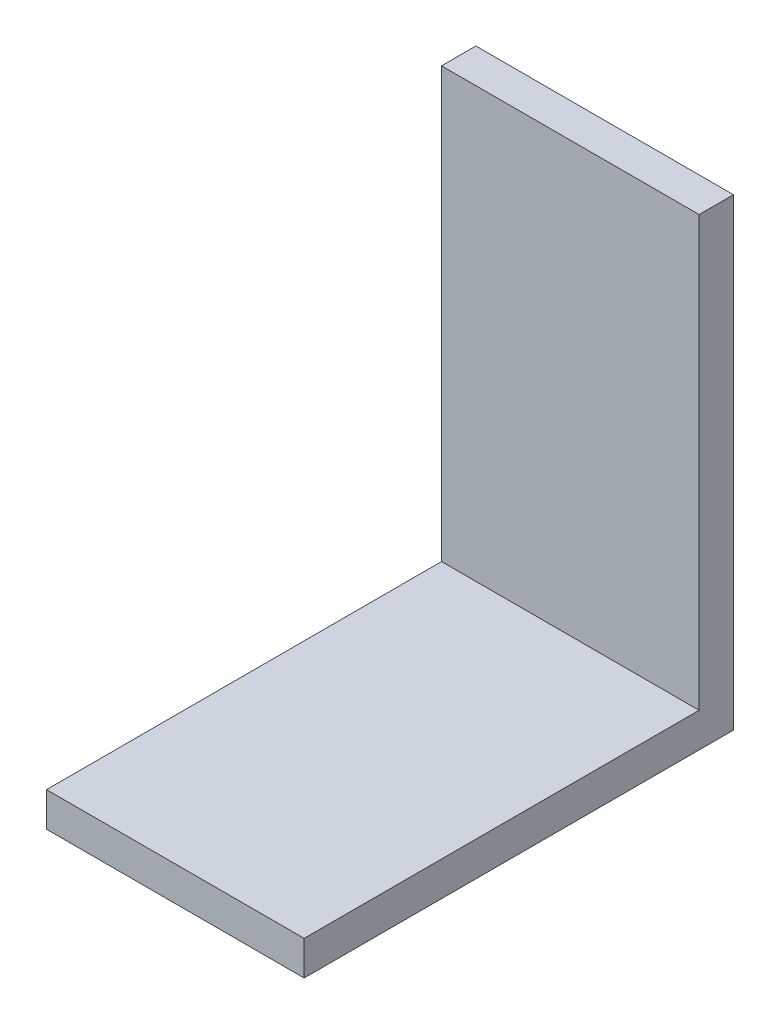
ISO-10303-21;
HEADER;
FILE_DESCRIPTION(('STEP AP214'),'2;1');
FILE_NAME('part.step','',(''),(''),'','','');
FILE_SCHEMA(('AUTOMOTIVE_DESIGN { 1 0 10303 214 1 1 1 1 }'));
ENDSEC;
DATA;
#1=APPLICATION_CONTEXT('core data for automotive mechanical design processes');
#2=APPLICATION_PROTOCOL_DEFINITION('international standard','automotive_design',2000,#1);
#3=PRODUCT_CONTEXT('',#1,'mechanical');
#4=PRODUCT('Part','Part','',(#3));
#5=PRODUCT_RELATED_PRODUCT_CATEGORY('part','',(#4));
#6=PRODUCT_DEFINITION_FORMATION('','',#4);
#7=PRODUCT_DEFINITION_CONTEXT('part definition',#1,'design');
#8=PRODUCT_DEFINITION('design','',#6,#7);
#9=PRODUCT_DEFINITION_SHAPE('','',#8);
#10=(LENGTH_UNIT() NAMED_UNIT(*) SI_UNIT(.MILLI.,.METRE.));
#11=(NAMED_UNIT(*) PLANE_ANGLE_UNIT() SI_UNIT($,.RADIAN.));
#12=(NAMED_UNIT(*) SI_UNIT($,.STERADIAN.) SOLID_ANGLE_UNIT());
#13=UNCERTAINTY_MEASURE_WITH_UNIT(LENGTH_MEASURE(1.E-05),#10,'distance_accuracy_value','');
#14=(GEOMETRIC_REPRESENTATION_CONTEXT(3) GLOBAL_UNCERTAINTY_ASSIGNED_CONTEXT((#13)) GLOBAL_UNIT_ASSIGNED_CONTEXT((#10,
#11,#12)) REPRESENTATION_CONTEXT('',''));
#15=CARTESIAN_POINT('',(0.,0.,0.));
#16=DIRECTION('',(0.,0.,1.));
#17=DIRECTION('',(1.,0.,0.));
#18=AXIS2_PLACEMENT_3D('',#15,#16,#17);
#19=CARTESIAN_POINT('',(0.,2.,0.));
#20=DIRECTION('',(0.,-1.,0.));
#21=DIRECTION('',(0.,0.,-1.));
#22=AXIS2_PLACEMENT_3D('',#19,#20,#21);
#23=PLANE('',#22);
#24=DIRECTION('',(1.,0.,0.));
#25=VECTOR('',#24,1.);
#26=CARTESIAN_POINT('',(-7.5,2.,-10.5));
#27=LINE('',#26,#25);
#28=CARTESIAN_POINT('',(-7.5,2.,-10.5));
#29=VERTEX_POINT('',#28);
#30=CARTESIAN_POINT('',(7.5,2.,-10.5));
#31=VERTEX_POINT('',#30);
#32=EDGE_CURVE('E55',#29,#31,#27,.T.);
#33=ORIENTED_EDGE('',*,*,#32,.F.);
#34=DIRECTION('',(0.,0.,1.));
#35=VECTOR('',#34,1.);
#36=CARTESIAN_POINT('',(-7.5,2.,12.5));
#37=LINE('',#36,#35);
#38=CARTESIAN_POINT('',(-7.5,2.,12.5));
#39=VERTEX_POINT('',#38);
#40=EDGE_CURVE('E157',#29,#39,#37,.T.);
#41=ORIENTED_EDGE('',*,*,#40,.T.);
#42=DIRECTION('',(1.,0.,0.));
#43=VECTOR('',#42,1.);
#44=CARTESIAN_POINT('',(-7.5,2.,12.5));
#45=LINE('',#44,#43);
#46=CARTESIAN_POINT('',(7.5,2.,12.5));
#47=VERTEX_POINT('',#46);
#48=EDGE_CURVE('E61',#39,#47,#45,.T.);
#49=ORIENTED_EDGE('',*,*,#48,.T.);
#50=DIRECTION('',(0.,0.,-1.));
#51=VECTOR('',#50,1.);
#52=CARTESIAN_POINT('',(7.5,2.,12.5));
#53=LINE('',#52,#51);
#54=EDGE_CURVE('E91',#47,#31,#53,.T.);
#55=ORIENTED_EDGE('',*,*,#54,.T.);
#56=EDGE_LOOP('',(#33,#41,#49,#55));
#57=FACE_BOUND('',#56,.T.);
#58=ADVANCED_FACE('F39',(#57),#23,.F.);
#59=CARTESIAN_POINT('',(7.5,2.,12.5));
#60=DIRECTION('',(-1.,0.,0.));
#61=DIRECTION('',(0.,0.,1.));
#62=AXIS2_PLACEMENT_3D('',#59,#60,#61);
#63=PLANE('',#62);
#64=DIRECTION('',(0.,0.,-1.));
#65=VECTOR('',#64,1.);
#66=CARTESIAN_POINT('',(7.5,0.,12.5));
#67=LINE('',#66,#65);
#68=CARTESIAN_POINT('',(7.5,0.,12.5));
#69=VERTEX_POINT('',#68);
#70=CARTESIAN_POINT('',(7.5,0.,-12.5));
#71=VERTEX_POINT('',#70);
#72=EDGE_CURVE('E97',#69,#71,#67,.T.);
#73=ORIENTED_EDGE('',*,*,#72,.T.);
#74=DIRECTION('',(0.,-1.,0.));
#75=VECTOR('',#74,1.);
#76=CARTESIAN_POINT('',(7.5,2.,-12.5));
#77=LINE('',#76,#75);
#78=CARTESIAN_POINT('',(7.5,27.,-12.5));
#79=VERTEX_POINT('',#78);
#80=EDGE_CURVE('E11',#79,#71,#77,.T.);
#81=ORIENTED_EDGE('',*,*,#80,.F.);
#82=DIRECTION('',(0.,0.,-1.));
#83=VECTOR('',#82,1.);
#84=CARTESIAN_POINT('',(7.5,27.,-10.5));
#85=LINE('',#84,#83);
#86=CARTESIAN_POINT('',(7.5,27.,-10.5));
#87=VERTEX_POINT('',#86);
#88=EDGE_CURVE('E141',#87,#79,#85,.T.);
#89=ORIENTED_EDGE('',*,*,#88,.F.);
#90=DIRECTION('',(0.,-1.,0.));
#91=VECTOR('',#90,1.);
#92=CARTESIAN_POINT('',(7.5,27.,-10.5));
#93=LINE('',#92,#91);
#94=EDGE_CURVE('E110',#87,#31,#93,.T.);
#95=ORIENTED_EDGE('',*,*,#94,.T.);
#96=ORIENTED_EDGE('',*,*,#54,.F.);
#97=DIRECTION('',(0.,-1.,0.));
#98=VECTOR('',#97,1.);
#99=CARTESIAN_POINT('',(7.5,2.,12.5));
#100=LINE('',#99,#98);
#101=EDGE_CURVE('E83',#47,#69,#100,.T.);
#102=ORIENTED_EDGE('',*,*,#101,.T.);
#103=EDGE_LOOP('',(#73,#81,#89,#95,#96,#102));
#104=FACE_BOUND('',#103,.T.);
#105=ADVANCED_FACE('F41',(#104),#63,.F.);
#106=CARTESIAN_POINT('',(-7.5,2.,-12.5));
#107=DIRECTION('',(0.,0.,1.));
#108=DIRECTION('',(1.,0.,0.));
#109=AXIS2_PLACEMENT_3D('',#106,#107,#108);
#110=PLANE('',#109);
#111=DIRECTION('',(-1.,0.,0.));
#112=VECTOR('',#111,1.);
#113=CARTESIAN_POINT('',(-7.5,0.,-12.5));
#114=LINE('',#113,#112);
#115=CARTESIAN_POINT('',(-7.5,0.,-12.5));
#116=VERTEX_POINT('',#115);
#117=EDGE_CURVE('E102',#71,#116,#114,.T.);
#118=ORIENTED_EDGE('',*,*,#117,.T.);
#119=DIRECTION('',(0.,-1.,0.));
#120=VECTOR('',#119,1.);
#121=CARTESIAN_POINT('',(-7.5,2.,-12.5));
#122=LINE('',#121,#120);
#123=CARTESIAN_POINT('',(-7.5,27.,-12.5));
#124=VERTEX_POINT('',#123);
#125=EDGE_CURVE('E48',#124,#116,#122,.T.);
#126=ORIENTED_EDGE('',*,*,#125,.F.);
#127=DIRECTION('',(-1.,0.,0.));
#128=VECTOR('',#127,1.);
#129=CARTESIAN_POINT('',(-7.5,27.,-12.5));
#130=LINE('',#129,#128);
#131=EDGE_CURVE('E133',#79,#124,#130,.T.);
#132=ORIENTED_EDGE('',*,*,#131,.F.);
#133=ORIENTED_EDGE('',*,*,#80,.T.);
#134=EDGE_LOOP('',(#118,#126,#132,#133));
#135=FACE_BOUND('',#134,.T.);
#136=ADVANCED_FACE('F131',(#135),#110,.F.);
#137=CARTESIAN_POINT('',(-7.5,2.,12.5));
#138=DIRECTION('',(1.,0.,0.));
#139=DIRECTION('',(0.,0.,-1.));
#140=AXIS2_PLACEMENT_3D('',#137,#138,#139);
#141=PLANE('',#140);
#142=DIRECTION('',(0.,0.,1.));
#143=VECTOR('',#142,1.);
#144=CARTESIAN_POINT('',(-7.5,0.,12.5));
#145=LINE('',#144,#143);
#146=CARTESIAN_POINT('',(-7.5,0.,12.5));
#147=VERTEX_POINT('',#146);
#148=EDGE_CURVE('E92',#116,#147,#145,.T.);
#149=ORIENTED_EDGE('',*,*,#148,.T.);
#150=DIRECTION('',(0.,-1.,0.));
#151=VECTOR('',#150,1.);
#152=CARTESIAN_POINT('',(-7.5,2.,12.5));
#153=LINE('',#152,#151);
#154=EDGE_CURVE('E86',#39,#147,#153,.T.);
#155=ORIENTED_EDGE('',*,*,#154,.F.);
#156=ORIENTED_EDGE('',*,*,#40,.F.);
#157=DIRECTION('',(0.,-1.,0.));
#158=VECTOR('',#157,1.);
#159=CARTESIAN_POINT('',(-7.5,27.,-10.5));
#160=LINE('',#159,#158);
#161=CARTESIAN_POINT('',(-7.5,27.,-10.5));
#162=VERTEX_POINT('',#161);
#163=EDGE_CURVE('E104',#162,#29,#160,.T.);
#164=ORIENTED_EDGE('',*,*,#163,.F.);
#165=DIRECTION('',(0.,0.,1.));
#166=VECTOR('',#165,1.);
#167=CARTESIAN_POINT('',(-7.5,27.,-10.5));
#168=LINE('',#167,#166);
#169=EDGE_CURVE('E127',#124,#162,#168,.T.);
#170=ORIENTED_EDGE('',*,*,#169,.F.);
#171=ORIENTED_EDGE('',*,*,#125,.T.);
#172=EDGE_LOOP('',(#149,#155,#156,#164,#170,#171));
#173=FACE_BOUND('',#172,.T.);
#174=ADVANCED_FACE('F123',(#173),#141,.F.);
#175=CARTESIAN_POINT('',(-7.5,2.,12.5));
#176=DIRECTION('',(0.,0.,-1.));
#177=DIRECTION('',(-1.,0.,0.));
#178=AXIS2_PLACEMENT_3D('',#175,#176,#177);
#179=PLANE('',#178);
#180=DIRECTION('',(1.,0.,0.));
#181=VECTOR('',#180,1.);
#182=CARTESIAN_POINT('',(-7.5,0.,12.5));
#183=LINE('',#182,#181);
#184=EDGE_CURVE('E80',#147,#69,#183,.T.);
#185=ORIENTED_EDGE('',*,*,#184,.T.);
#186=ORIENTED_EDGE('',*,*,#101,.F.);
#187=ORIENTED_EDGE('',*,*,#48,.F.);
#188=ORIENTED_EDGE('',*,*,#154,.T.);
#189=EDGE_LOOP('',(#185,#186,#187,#188));
#190=FACE_BOUND('',#189,.T.);
#191=ADVANCED_FACE('F82',(#190),#179,.F.);
#192=CARTESIAN_POINT('',(0.,0.,0.));
#193=DIRECTION('',(0.,-1.,0.));
#194=DIRECTION('',(0.,0.,-1.));
#195=AXIS2_PLACEMENT_3D('',#192,#193,#194);
#196=PLANE('',#195);
#197=ORIENTED_EDGE('',*,*,#72,.F.);
#198=ORIENTED_EDGE('',*,*,#184,.F.);
#199=ORIENTED_EDGE('',*,*,#148,.F.);
#200=ORIENTED_EDGE('',*,*,#117,.F.);
#201=EDGE_LOOP('',(#197,#198,#199,#200));
#202=FACE_BOUND('',#201,.T.);
#203=ADVANCED_FACE('F101',(#202),#196,.T.);
#204=CARTESIAN_POINT('',(-7.5,27.,-10.5));
#205=DIRECTION('',(0.,0.,-1.));
#206=DIRECTION('',(-1.,0.,0.));
#207=AXIS2_PLACEMENT_3D('',#204,#205,#206);
#208=PLANE('',#207);
#209=ORIENTED_EDGE('',*,*,#32,.T.);
#210=ORIENTED_EDGE('',*,*,#94,.F.);
#211=DIRECTION('',(1.,0.,0.));
#212=VECTOR('',#211,1.);
#213=CARTESIAN_POINT('',(-7.5,27.,-10.5));
#214=LINE('',#213,#212);
#215=EDGE_CURVE('E146',#162,#87,#214,.T.);
#216=ORIENTED_EDGE('',*,*,#215,.F.);
#217=ORIENTED_EDGE('',*,*,#163,.T.);
#218=EDGE_LOOP('',(#209,#210,#216,#217));
#219=FACE_BOUND('',#218,.T.);
#220=ADVANCED_FACE('F162',(#219),#208,.F.);
#221=CARTESIAN_POINT('',(0.,27.,0.));
#222=DIRECTION('',(0.,-1.,0.));
#223=DIRECTION('',(0.,0.,-1.));
#224=AXIS2_PLACEMENT_3D('',#221,#222,#223);
#225=PLANE('',#224);
#226=ORIENTED_EDGE('',*,*,#88,.T.);
#227=ORIENTED_EDGE('',*,*,#131,.T.);
#228=ORIENTED_EDGE('',*,*,#169,.T.);
#229=ORIENTED_EDGE('',*,*,#215,.T.);
#230=EDGE_LOOP('',(#226,#227,#228,#229));
#231=FACE_BOUND('',#230,.T.);
#232=ADVANCED_FACE('F138',(#231),#225,.F.);
#233=CLOSED_SHELL('',(#58,#105,#136,#174,#191,#203,#220,#232));
#234=MANIFOLD_SOLID_BREP('B2',#233);
#235=ADVANCED_BREP_SHAPE_REPRESENTATION('',(#18,#234),#14);
#236=SHAPE_DEFINITION_REPRESENTATION(#9,#235);
ENDSEC;
END-ISO-10303-21;
